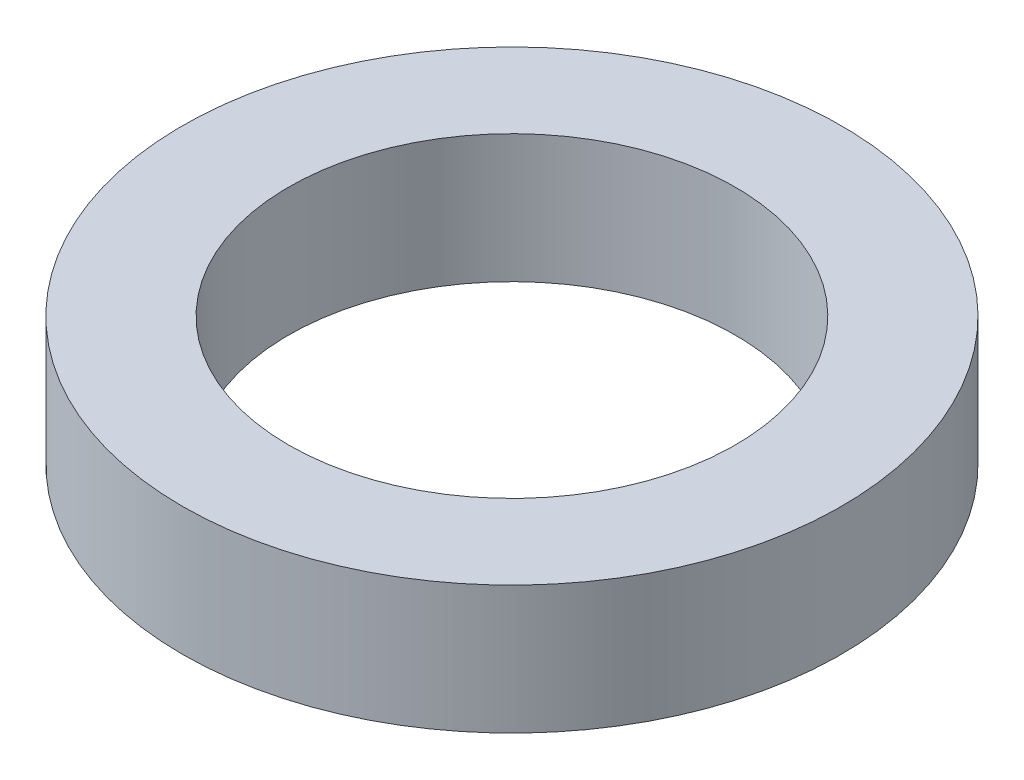
ISO-10303-21;
HEADER;
FILE_DESCRIPTION(('STEP AP214'),'2;1');
FILE_NAME('part.step','',(''),(''),'','','');
FILE_SCHEMA(('AUTOMOTIVE_DESIGN { 1 0 10303 214 1 1 1 1 }'));
ENDSEC;
DATA;
#1=APPLICATION_CONTEXT('core data for automotive mechanical design processes');
#2=APPLICATION_PROTOCOL_DEFINITION('international standard','automotive_design',2000,#1);
#3=PRODUCT_CONTEXT('',#1,'mechanical');
#4=PRODUCT('Part','Part','',(#3));
#5=PRODUCT_RELATED_PRODUCT_CATEGORY('part','',(#4));
#6=PRODUCT_DEFINITION_FORMATION('','',#4);
#7=PRODUCT_DEFINITION_CONTEXT('part definition',#1,'design');
#8=PRODUCT_DEFINITION('design','',#6,#7);
#9=PRODUCT_DEFINITION_SHAPE('','',#8);
#10=(LENGTH_UNIT() NAMED_UNIT(*) SI_UNIT(.MILLI.,.METRE.));
#11=(NAMED_UNIT(*) PLANE_ANGLE_UNIT() SI_UNIT($,.RADIAN.));
#12=(NAMED_UNIT(*) SI_UNIT($,.STERADIAN.) SOLID_ANGLE_UNIT());
#13=UNCERTAINTY_MEASURE_WITH_UNIT(LENGTH_MEASURE(1.E-05),#10,'distance_accuracy_value','');
#14=(GEOMETRIC_REPRESENTATION_CONTEXT(3) GLOBAL_UNCERTAINTY_ASSIGNED_CONTEXT((#13)) GLOBAL_UNIT_ASSIGNED_CONTEXT((#10,
#11,#12)) REPRESENTATION_CONTEXT('',''));
#15=CARTESIAN_POINT('',(0.,0.,0.));
#16=DIRECTION('',(0.,0.,1.));
#17=DIRECTION('',(1.,0.,0.));
#18=AXIS2_PLACEMENT_3D('',#15,#16,#17);
#19=CARTESIAN_POINT('',(-19.0091828831705,-237.,-53.2448828787845));
#20=DIRECTION('',(0.,-1.,0.));
#21=DIRECTION('',(0.,0.,-1.));
#22=AXIS2_PLACEMENT_3D('',#19,#20,#21);
#23=CYLINDRICAL_SURFACE('',#22,9.);
#24=CARTESIAN_POINT('',(-19.0091828831705,-237.,-53.2448828787845));
#25=DIRECTION('',(0.,1.,0.));
#26=DIRECTION('',(0.,0.,1.));
#27=AXIS2_PLACEMENT_3D('',#24,#25,#26);
#28=CIRCLE('',#27,9.);
#29=CARTESIAN_POINT('',(-19.0091828831705,-237.,-44.2448828787845));
#30=VERTEX_POINT('',#29);
#31=EDGE_CURVE('E10',#30,#30,#28,.T.);
#32=ORIENTED_EDGE('',*,*,#31,.F.);
#33=EDGE_LOOP('',(#32));
#34=FACE_BOUND('',#33,.T.);
#35=CARTESIAN_POINT('',(-19.0091828831705,-240.5,-53.2448828787845));
#36=DIRECTION('',(0.,1.,0.));
#37=DIRECTION('',(0.,0.,1.));
#38=AXIS2_PLACEMENT_3D('',#35,#36,#37);
#39=CIRCLE('',#38,9.);
#40=CARTESIAN_POINT('',(-19.0091828831705,-240.5,-44.2448828787845));
#41=VERTEX_POINT('',#40);
#42=EDGE_CURVE('E46',#41,#41,#39,.T.);
#43=ORIENTED_EDGE('',*,*,#42,.T.);
#44=EDGE_LOOP('',(#43));
#45=FACE_BOUND('',#44,.T.);
#46=ADVANCED_FACE('F39',(#34,#45),#23,.T.);
#47=CARTESIAN_POINT('',(-19.0091828831705,-237.,-53.2448828787845));
#48=DIRECTION('',(0.,1.,0.));
#49=DIRECTION('',(0.,0.,1.));
#50=AXIS2_PLACEMENT_3D('',#47,#48,#49);
#51=PLANE('',#50);
#52=CARTESIAN_POINT('',(-19.0091828831705,-237.,-53.2448828787845));
#53=DIRECTION('',(0.,1.,0.));
#54=DIRECTION('',(0.,0.,1.));
#55=AXIS2_PLACEMENT_3D('',#52,#53,#54);
#56=CIRCLE('',#55,6.1);
#57=CARTESIAN_POINT('',(-19.0091828831705,-237.,-47.1448828787845));
#58=VERTEX_POINT('',#57);
#59=EDGE_CURVE('E51',#58,#58,#56,.F.);
#60=ORIENTED_EDGE('',*,*,#59,.T.);
#61=EDGE_LOOP('',(#60));
#62=FACE_BOUND('',#61,.T.);
#63=ORIENTED_EDGE('',*,*,#31,.T.);
#64=EDGE_LOOP('',(#63));
#65=FACE_BOUND('',#64,.T.);
#66=ADVANCED_FACE('F63',(#62,#65),#51,.T.);
#67=CARTESIAN_POINT('',(-19.0091828831705,-240.5,-53.2448828787845));
#68=DIRECTION('',(0.,1.,0.));
#69=DIRECTION('',(0.,0.,1.));
#70=AXIS2_PLACEMENT_3D('',#67,#68,#69);
#71=PLANE('',#70);
#72=CARTESIAN_POINT('',(-19.0091828831705,-240.5,-53.2448828787845));
#73=DIRECTION('',(0.,1.,0.));
#74=DIRECTION('',(0.,0.,1.));
#75=AXIS2_PLACEMENT_3D('',#72,#73,#74);
#76=CIRCLE('',#75,6.1);
#77=CARTESIAN_POINT('',(-19.0091828831705,-240.5,-47.1448828787845));
#78=VERTEX_POINT('',#77);
#79=EDGE_CURVE('E45',#78,#78,#76,.F.);
#80=ORIENTED_EDGE('',*,*,#79,.F.);
#81=EDGE_LOOP('',(#80));
#82=FACE_BOUND('',#81,.T.);
#83=ORIENTED_EDGE('',*,*,#42,.F.);
#84=EDGE_LOOP('',(#83));
#85=FACE_BOUND('',#84,.T.);
#86=ADVANCED_FACE('F61',(#82,#85),#71,.F.);
#87=CARTESIAN_POINT('',(-19.0091828831705,-236.9,-53.2448828787845));
#88=DIRECTION('',(0.,-1.,0.));
#89=DIRECTION('',(0.,0.,-1.));
#90=AXIS2_PLACEMENT_3D('',#87,#88,#89);
#91=CYLINDRICAL_SURFACE('',#90,6.1);
#92=ORIENTED_EDGE('',*,*,#59,.F.);
#93=EDGE_LOOP('',(#92));
#94=FACE_BOUND('',#93,.T.);
#95=ORIENTED_EDGE('',*,*,#79,.T.);
#96=EDGE_LOOP('',(#95));
#97=FACE_BOUND('',#96,.T.);
#98=ADVANCED_FACE('F56',(#94,#97),#91,.F.);
#99=CLOSED_SHELL('',(#46,#66,#86,#98));
#100=MANIFOLD_SOLID_BREP('B2',#99);
#101=ADVANCED_BREP_SHAPE_REPRESENTATION('',(#18,#100),#14);
#102=SHAPE_DEFINITION_REPRESENTATION(#9,#101);
ENDSEC;
END-ISO-10303-21;
